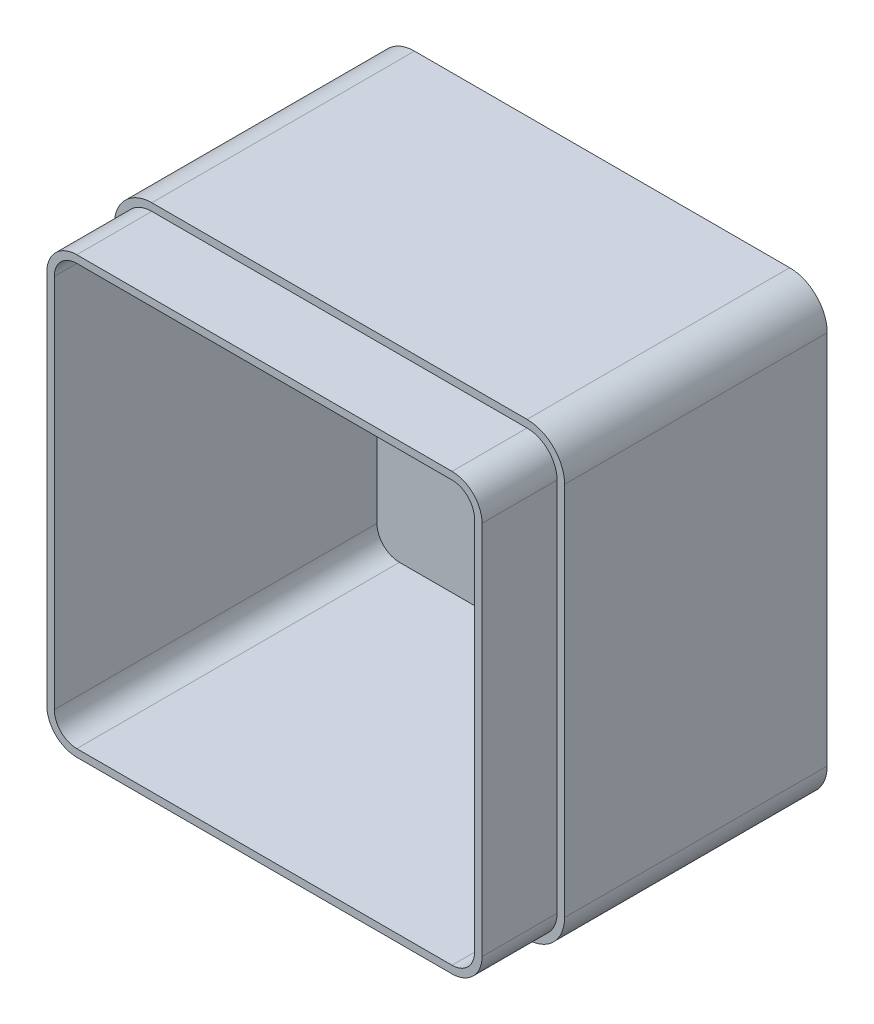
ISO-10303-21;
HEADER;
FILE_DESCRIPTION(('STEP AP214'),'2;1');
FILE_NAME('part.step','',(''),(''),'','','');
FILE_SCHEMA(('AUTOMOTIVE_DESIGN { 1 0 10303 214 1 1 1 1 }'));
ENDSEC;
DATA;
#1=APPLICATION_CONTEXT('core data for automotive mechanical design processes');
#2=APPLICATION_PROTOCOL_DEFINITION('international standard','automotive_design',2000,#1);
#3=PRODUCT_CONTEXT('',#1,'mechanical');
#4=PRODUCT('Part','Part','',(#3));
#5=PRODUCT_RELATED_PRODUCT_CATEGORY('part','',(#4));
#6=PRODUCT_DEFINITION_FORMATION('','',#4);
#7=PRODUCT_DEFINITION_CONTEXT('part definition',#1,'design');
#8=PRODUCT_DEFINITION('design','',#6,#7);
#9=PRODUCT_DEFINITION_SHAPE('','',#8);
#10=(LENGTH_UNIT() NAMED_UNIT(*) SI_UNIT(.MILLI.,.METRE.));
#11=(NAMED_UNIT(*) PLANE_ANGLE_UNIT() SI_UNIT($,.RADIAN.));
#12=(NAMED_UNIT(*) SI_UNIT($,.STERADIAN.) SOLID_ANGLE_UNIT());
#13=UNCERTAINTY_MEASURE_WITH_UNIT(LENGTH_MEASURE(1.E-05),#10,'distance_accuracy_value','');
#14=(GEOMETRIC_REPRESENTATION_CONTEXT(3) GLOBAL_UNCERTAINTY_ASSIGNED_CONTEXT((#13)) GLOBAL_UNIT_ASSIGNED_CONTEXT((#10,
#11,#12)) REPRESENTATION_CONTEXT('',''));
#15=CARTESIAN_POINT('',(0.,0.,0.));
#16=DIRECTION('',(0.,0.,1.));
#17=DIRECTION('',(1.,0.,0.));
#18=AXIS2_PLACEMENT_3D('',#15,#16,#17);
#19=CARTESIAN_POINT('',(0.,0.,90.));
#20=DIRECTION('',(0.,0.,-1.));
#21=DIRECTION('',(-1.,0.,0.));
#22=AXIS2_PLACEMENT_3D('',#19,#20,#21);
#23=PLANE('',#22);
#24=DIRECTION('',(0.,-1.,0.));
#25=VECTOR('',#24,1.);
#26=CARTESIAN_POINT('',(4.,0.,90.));
#27=LINE('',#26,#25);
#28=CARTESIAN_POINT('',(3.99999999999996,110.,90.));
#29=VERTEX_POINT('',#28);
#30=CARTESIAN_POINT('',(4.,10.,90.));
#31=VERTEX_POINT('',#30);
#32=EDGE_CURVE('E350',#29,#31,#27,.T.);
#33=ORIENTED_EDGE('',*,*,#32,.F.);
#34=CARTESIAN_POINT('',(9.99999999999996,110.,90.));
#35=DIRECTION('',(0.,0.,-1.));
#36=DIRECTION('',(-1.,0.,0.));
#37=AXIS2_PLACEMENT_3D('',#34,#35,#36);
#38=CIRCLE('',#37,6.);
#39=CARTESIAN_POINT('',(9.99999999999996,116.,90.));
#40=VERTEX_POINT('',#39);
#41=EDGE_CURVE('E396',#40,#29,#38,.F.);
#42=ORIENTED_EDGE('',*,*,#41,.F.);
#43=DIRECTION('',(-1.,0.,0.));
#44=VECTOR('',#43,1.);
#45=CARTESIAN_POINT('',(0.,116.,90.));
#46=LINE('',#45,#44);
#47=CARTESIAN_POINT('',(110.,116.,90.));
#48=VERTEX_POINT('',#47);
#49=EDGE_CURVE('E365',#48,#40,#46,.T.);
#50=ORIENTED_EDGE('',*,*,#49,.F.);
#51=CARTESIAN_POINT('',(110.,110.,90.));
#52=DIRECTION('',(0.,0.,-1.));
#53=DIRECTION('',(-1.,0.,0.));
#54=AXIS2_PLACEMENT_3D('',#51,#52,#53);
#55=CIRCLE('',#54,6.);
#56=CARTESIAN_POINT('',(116.,110.,90.));
#57=VERTEX_POINT('',#56);
#58=EDGE_CURVE('E329',#57,#48,#55,.F.);
#59=ORIENTED_EDGE('',*,*,#58,.F.);
#60=DIRECTION('',(0.,1.,0.));
#61=VECTOR('',#60,1.);
#62=CARTESIAN_POINT('',(116.,0.,90.));
#63=LINE('',#62,#61);
#64=CARTESIAN_POINT('',(116.,10.,90.));
#65=VERTEX_POINT('',#64);
#66=EDGE_CURVE('E393',#65,#57,#63,.T.);
#67=ORIENTED_EDGE('',*,*,#66,.F.);
#68=CARTESIAN_POINT('',(110.,10.,90.));
#69=DIRECTION('',(0.,0.,-1.));
#70=DIRECTION('',(-1.,0.,0.));
#71=AXIS2_PLACEMENT_3D('',#68,#69,#70);
#72=CIRCLE('',#71,6.);
#73=CARTESIAN_POINT('',(110.,4.,90.));
#74=VERTEX_POINT('',#73);
#75=EDGE_CURVE('E389',#74,#65,#72,.F.);
#76=ORIENTED_EDGE('',*,*,#75,.F.);
#77=DIRECTION('',(1.,0.,0.));
#78=VECTOR('',#77,1.);
#79=CARTESIAN_POINT('',(0.,4.,90.));
#80=LINE('',#79,#78);
#81=CARTESIAN_POINT('',(9.99999999999999,4.,90.));
#82=VERTEX_POINT('',#81);
#83=EDGE_CURVE('E386',#82,#74,#80,.T.);
#84=ORIENTED_EDGE('',*,*,#83,.F.);
#85=CARTESIAN_POINT('',(9.99999999999999,10.,90.));
#86=DIRECTION('',(0.,0.,-1.));
#87=DIRECTION('',(-1.,0.,0.));
#88=AXIS2_PLACEMENT_3D('',#85,#86,#87);
#89=CIRCLE('',#88,6.);
#90=EDGE_CURVE('E374',#31,#82,#89,.F.);
#91=ORIENTED_EDGE('',*,*,#90,.F.);
#92=EDGE_LOOP('',(#33,#42,#50,#59,#67,#76,#84,#91));
#93=FACE_BOUND('',#92,.T.);
#94=CARTESIAN_POINT('',(9.99999999999996,110.,90.));
#95=DIRECTION('',(0.,0.,1.));
#96=DIRECTION('',(1.,0.,0.));
#97=AXIS2_PLACEMENT_3D('',#94,#95,#96);
#98=CIRCLE('',#97,8.);
#99=CARTESIAN_POINT('',(9.99999999999995,118.,90.));
#100=VERTEX_POINT('',#99);
#101=CARTESIAN_POINT('',(1.99999999999996,110.,90.));
#102=VERTEX_POINT('',#101);
#103=EDGE_CURVE('E257',#100,#102,#98,.T.);
#104=ORIENTED_EDGE('',*,*,#103,.T.);
#105=DIRECTION('',(0.,-1.,0.));
#106=VECTOR('',#105,1.);
#107=CARTESIAN_POINT('',(1.99999999999996,110.,90.));
#108=LINE('',#107,#106);
#109=CARTESIAN_POINT('',(1.99999999999996,9.99999999999999,90.));
#110=VERTEX_POINT('',#109);
#111=EDGE_CURVE('E207',#102,#110,#108,.T.);
#112=ORIENTED_EDGE('',*,*,#111,.T.);
#113=CARTESIAN_POINT('',(9.99999999999999,10.,90.));
#114=DIRECTION('',(0.,0.,1.));
#115=DIRECTION('',(1.,0.,0.));
#116=AXIS2_PLACEMENT_3D('',#113,#114,#115);
#117=CIRCLE('',#116,8.00000000000001);
#118=CARTESIAN_POINT('',(9.99999999999999,1.99999999999998,90.));
#119=VERTEX_POINT('',#118);
#120=EDGE_CURVE('E55',#110,#119,#117,.T.);
#121=ORIENTED_EDGE('',*,*,#120,.T.);
#122=DIRECTION('',(1.,0.,0.));
#123=VECTOR('',#122,1.);
#124=CARTESIAN_POINT('',(9.99999999999999,2.,90.));
#125=LINE('',#124,#123);
#126=CARTESIAN_POINT('',(110.,2.,90.));
#127=VERTEX_POINT('',#126);
#128=EDGE_CURVE('E264',#119,#127,#125,.T.);
#129=ORIENTED_EDGE('',*,*,#128,.T.);
#130=CARTESIAN_POINT('',(110.,10.,90.));
#131=DIRECTION('',(0.,0.,1.));
#132=DIRECTION('',(1.,0.,0.));
#133=AXIS2_PLACEMENT_3D('',#130,#131,#132);
#134=CIRCLE('',#133,7.99999999999999);
#135=CARTESIAN_POINT('',(118.,10.,90.));
#136=VERTEX_POINT('',#135);
#137=EDGE_CURVE('E268',#127,#136,#134,.T.);
#138=ORIENTED_EDGE('',*,*,#137,.T.);
#139=DIRECTION('',(0.,1.,0.));
#140=VECTOR('',#139,1.);
#141=CARTESIAN_POINT('',(118.,9.99999999999999,90.));
#142=LINE('',#141,#140);
#143=CARTESIAN_POINT('',(118.,110.,90.));
#144=VERTEX_POINT('',#143);
#145=EDGE_CURVE('E272',#136,#144,#142,.T.);
#146=ORIENTED_EDGE('',*,*,#145,.T.);
#147=CARTESIAN_POINT('',(110.,110.,90.));
#148=DIRECTION('',(0.,0.,1.));
#149=DIRECTION('',(1.,0.,0.));
#150=AXIS2_PLACEMENT_3D('',#147,#148,#149);
#151=CIRCLE('',#150,8.00000000000001);
#152=CARTESIAN_POINT('',(110.,118.,90.));
#153=VERTEX_POINT('',#152);
#154=EDGE_CURVE('E234',#144,#153,#151,.T.);
#155=ORIENTED_EDGE('',*,*,#154,.T.);
#156=DIRECTION('',(-1.,0.,0.));
#157=VECTOR('',#156,1.);
#158=CARTESIAN_POINT('',(110.,118.,90.));
#159=LINE('',#158,#157);
#160=EDGE_CURVE('E230',#153,#100,#159,.T.);
#161=ORIENTED_EDGE('',*,*,#160,.T.);
#162=EDGE_LOOP('',(#104,#112,#121,#129,#138,#146,#155,#161));
#163=FACE_BOUND('',#162,.T.);
#164=ADVANCED_FACE('F39',(#93,#163),#23,.F.);
#165=CARTESIAN_POINT('',(4.,0.,90.));
#166=DIRECTION('',(1.,0.,0.));
#167=DIRECTION('',(0.,1.,0.));
#168=AXIS2_PLACEMENT_3D('',#165,#166,#167);
#169=PLANE('',#168);
#170=DIRECTION('',(0.,-1.,0.));
#171=VECTOR('',#170,1.);
#172=CARTESIAN_POINT('',(4.,0.,4.));
#173=LINE('',#172,#171);
#174=CARTESIAN_POINT('',(3.99999999999996,110.,4.));
#175=VERTEX_POINT('',#174);
#176=CARTESIAN_POINT('',(4.,10.,4.));
#177=VERTEX_POINT('',#176);
#178=EDGE_CURVE('E321',#175,#177,#173,.T.);
#179=ORIENTED_EDGE('',*,*,#178,.F.);
#180=DIRECTION('',(0.,0.,1.));
#181=VECTOR('',#180,1.);
#182=CARTESIAN_POINT('',(3.99999999999996,110.,90.));
#183=LINE('',#182,#181);
#184=EDGE_CURVE('E330',#29,#175,#183,.F.);
#185=ORIENTED_EDGE('',*,*,#184,.F.);
#186=ORIENTED_EDGE('',*,*,#32,.T.);
#187=DIRECTION('',(0.,0.,1.));
#188=VECTOR('',#187,1.);
#189=CARTESIAN_POINT('',(4.,10.,90.));
#190=LINE('',#189,#188);
#191=EDGE_CURVE('E326',#177,#31,#190,.T.);
#192=ORIENTED_EDGE('',*,*,#191,.F.);
#193=EDGE_LOOP('',(#179,#185,#186,#192));
#194=FACE_BOUND('',#193,.T.);
#195=ADVANCED_FACE('F504',(#194),#169,.T.);
#196=CARTESIAN_POINT('',(0.,4.,90.));
#197=DIRECTION('',(0.,1.,0.));
#198=DIRECTION('',(0.,0.,1.));
#199=AXIS2_PLACEMENT_3D('',#196,#197,#198);
#200=PLANE('',#199);
#201=ORIENTED_EDGE('',*,*,#83,.T.);
#202=DIRECTION('',(0.,0.,1.));
#203=VECTOR('',#202,1.);
#204=CARTESIAN_POINT('',(110.,4.,90.));
#205=LINE('',#204,#203);
#206=CARTESIAN_POINT('',(110.,4.,4.));
#207=VERTEX_POINT('',#206);
#208=EDGE_CURVE('E362',#207,#74,#205,.T.);
#209=ORIENTED_EDGE('',*,*,#208,.F.);
#210=DIRECTION('',(1.,0.,0.));
#211=VECTOR('',#210,1.);
#212=CARTESIAN_POINT('',(0.,4.,4.));
#213=LINE('',#212,#211);
#214=CARTESIAN_POINT('',(9.99999999999999,4.,4.));
#215=VERTEX_POINT('',#214);
#216=EDGE_CURVE('E325',#215,#207,#213,.T.);
#217=ORIENTED_EDGE('',*,*,#216,.F.);
#218=DIRECTION('',(0.,0.,1.));
#219=VECTOR('',#218,1.);
#220=CARTESIAN_POINT('',(9.99999999999999,4.,90.));
#221=LINE('',#220,#219);
#222=EDGE_CURVE('E353',#82,#215,#221,.F.);
#223=ORIENTED_EDGE('',*,*,#222,.F.);
#224=EDGE_LOOP('',(#201,#209,#217,#223));
#225=FACE_BOUND('',#224,.T.);
#226=ADVANCED_FACE('F510',(#225),#200,.T.);
#227=CARTESIAN_POINT('',(116.,0.,90.));
#228=DIRECTION('',(-1.,0.,0.));
#229=DIRECTION('',(0.,-1.,0.));
#230=AXIS2_PLACEMENT_3D('',#227,#228,#229);
#231=PLANE('',#230);
#232=ORIENTED_EDGE('',*,*,#66,.T.);
#233=DIRECTION('',(0.,0.,1.));
#234=VECTOR('',#233,1.);
#235=CARTESIAN_POINT('',(116.,110.,90.));
#236=LINE('',#235,#234);
#237=CARTESIAN_POINT('',(116.,110.,4.));
#238=VERTEX_POINT('',#237);
#239=EDGE_CURVE('E371',#238,#57,#236,.T.);
#240=ORIENTED_EDGE('',*,*,#239,.F.);
#241=DIRECTION('',(0.,1.,0.));
#242=VECTOR('',#241,1.);
#243=CARTESIAN_POINT('',(116.,0.,4.));
#244=LINE('',#243,#242);
#245=CARTESIAN_POINT('',(116.,10.,4.));
#246=VERTEX_POINT('',#245);
#247=EDGE_CURVE('E338',#246,#238,#244,.T.);
#248=ORIENTED_EDGE('',*,*,#247,.F.);
#249=DIRECTION('',(0.,0.,1.));
#250=VECTOR('',#249,1.);
#251=CARTESIAN_POINT('',(116.,10.,90.));
#252=LINE('',#251,#250);
#253=EDGE_CURVE('E366',#65,#246,#252,.F.);
#254=ORIENTED_EDGE('',*,*,#253,.F.);
#255=EDGE_LOOP('',(#232,#240,#248,#254));
#256=FACE_BOUND('',#255,.T.);
#257=ADVANCED_FACE('F704',(#256),#231,.T.);
#258=CARTESIAN_POINT('',(0.,116.,90.));
#259=DIRECTION('',(0.,-1.,0.));
#260=DIRECTION('',(0.,0.,-1.));
#261=AXIS2_PLACEMENT_3D('',#258,#259,#260);
#262=PLANE('',#261);
#263=DIRECTION('',(-1.,0.,0.));
#264=VECTOR('',#263,1.);
#265=CARTESIAN_POINT('',(0.,116.,4.));
#266=LINE('',#265,#264);
#267=CARTESIAN_POINT('',(110.,116.,4.));
#268=VERTEX_POINT('',#267);
#269=CARTESIAN_POINT('',(9.99999999999996,116.,4.));
#270=VERTEX_POINT('',#269);
#271=EDGE_CURVE('E346',#268,#270,#266,.T.);
#272=ORIENTED_EDGE('',*,*,#271,.F.);
#273=DIRECTION('',(0.,0.,-1.));
#274=VECTOR('',#273,1.);
#275=CARTESIAN_POINT('',(110.,116.,90.));
#276=LINE('',#275,#274);
#277=EDGE_CURVE('E370',#48,#268,#276,.T.);
#278=ORIENTED_EDGE('',*,*,#277,.F.);
#279=ORIENTED_EDGE('',*,*,#49,.T.);
#280=DIRECTION('',(0.,0.,-1.));
#281=VECTOR('',#280,1.);
#282=CARTESIAN_POINT('',(9.99999999999996,116.,90.));
#283=LINE('',#282,#281);
#284=EDGE_CURVE('E378',#270,#40,#283,.F.);
#285=ORIENTED_EDGE('',*,*,#284,.F.);
#286=EDGE_LOOP('',(#272,#278,#279,#285));
#287=FACE_BOUND('',#286,.T.);
#288=ADVANCED_FACE('F694',(#287),#262,.T.);
#289=CARTESIAN_POINT('',(0.,0.,4.));
#290=DIRECTION('',(0.,0.,-1.));
#291=DIRECTION('',(-1.,0.,0.));
#292=AXIS2_PLACEMENT_3D('',#289,#290,#291);
#293=PLANE('',#292);
#294=ORIENTED_EDGE('',*,*,#216,.T.);
#295=CARTESIAN_POINT('',(110.,10.,4.));
#296=DIRECTION('',(0.,0.,-1.));
#297=DIRECTION('',(-1.,0.,0.));
#298=AXIS2_PLACEMENT_3D('',#295,#296,#297);
#299=CIRCLE('',#298,6.);
#300=EDGE_CURVE('E341',#246,#207,#299,.T.);
#301=ORIENTED_EDGE('',*,*,#300,.F.);
#302=ORIENTED_EDGE('',*,*,#247,.T.);
#303=CARTESIAN_POINT('',(110.,110.,4.));
#304=DIRECTION('',(0.,0.,-1.));
#305=DIRECTION('',(-1.,0.,0.));
#306=AXIS2_PLACEMENT_3D('',#303,#304,#305);
#307=CIRCLE('',#306,6.);
#308=EDGE_CURVE('E345',#268,#238,#307,.T.);
#309=ORIENTED_EDGE('',*,*,#308,.F.);
#310=ORIENTED_EDGE('',*,*,#271,.T.);
#311=CARTESIAN_POINT('',(9.99999999999996,110.,4.));
#312=DIRECTION('',(0.,0.,-1.));
#313=DIRECTION('',(-1.,0.,0.));
#314=AXIS2_PLACEMENT_3D('',#311,#312,#313);
#315=CIRCLE('',#314,6.);
#316=EDGE_CURVE('E342',#175,#270,#315,.T.);
#317=ORIENTED_EDGE('',*,*,#316,.F.);
#318=ORIENTED_EDGE('',*,*,#178,.T.);
#319=CARTESIAN_POINT('',(9.99999999999999,10.,4.));
#320=DIRECTION('',(0.,0.,-1.));
#321=DIRECTION('',(-1.,0.,0.));
#322=AXIS2_PLACEMENT_3D('',#319,#320,#321);
#323=CIRCLE('',#322,6.);
#324=EDGE_CURVE('E334',#215,#177,#323,.T.);
#325=ORIENTED_EDGE('',*,*,#324,.F.);
#326=EDGE_LOOP('',(#294,#301,#302,#309,#310,#317,#318,#325));
#327=FACE_BOUND('',#326,.T.);
#328=ADVANCED_FACE('F684',(#327),#293,.F.);
#329=CARTESIAN_POINT('',(9.99999999999999,10.,90.));
#330=DIRECTION('',(0.,0.,-1.));
#331=DIRECTION('',(-1.,0.,0.));
#332=AXIS2_PLACEMENT_3D('',#329,#330,#331);
#333=CYLINDRICAL_SURFACE('',#332,6.);
#334=ORIENTED_EDGE('',*,*,#90,.T.);
#335=ORIENTED_EDGE('',*,*,#222,.T.);
#336=ORIENTED_EDGE('',*,*,#324,.T.);
#337=ORIENTED_EDGE('',*,*,#191,.T.);
#338=EDGE_LOOP('',(#334,#335,#336,#337));
#339=FACE_BOUND('',#338,.T.);
#340=ADVANCED_FACE('F674',(#339),#333,.F.);
#341=CARTESIAN_POINT('',(110.,10.,90.));
#342=DIRECTION('',(0.,0.,-1.));
#343=DIRECTION('',(-1.,0.,0.));
#344=AXIS2_PLACEMENT_3D('',#341,#342,#343);
#345=CYLINDRICAL_SURFACE('',#344,6.);
#346=ORIENTED_EDGE('',*,*,#75,.T.);
#347=ORIENTED_EDGE('',*,*,#253,.T.);
#348=ORIENTED_EDGE('',*,*,#300,.T.);
#349=ORIENTED_EDGE('',*,*,#208,.T.);
#350=EDGE_LOOP('',(#346,#347,#348,#349));
#351=FACE_BOUND('',#350,.T.);
#352=ADVANCED_FACE('F665',(#351),#345,.F.);
#353=CARTESIAN_POINT('',(9.99999999999996,110.,90.));
#354=DIRECTION('',(0.,0.,-1.));
#355=DIRECTION('',(-1.,0.,0.));
#356=AXIS2_PLACEMENT_3D('',#353,#354,#355);
#357=CYLINDRICAL_SURFACE('',#356,6.);
#358=ORIENTED_EDGE('',*,*,#41,.T.);
#359=ORIENTED_EDGE('',*,*,#184,.T.);
#360=ORIENTED_EDGE('',*,*,#316,.T.);
#361=ORIENTED_EDGE('',*,*,#284,.T.);
#362=EDGE_LOOP('',(#358,#359,#360,#361));
#363=FACE_BOUND('',#362,.T.);
#364=ADVANCED_FACE('F656',(#363),#357,.F.);
#365=CARTESIAN_POINT('',(110.,110.,90.));
#366=DIRECTION('',(0.,0.,-1.));
#367=DIRECTION('',(-1.,0.,0.));
#368=AXIS2_PLACEMENT_3D('',#365,#366,#367);
#369=CYLINDRICAL_SURFACE('',#368,6.);
#370=ORIENTED_EDGE('',*,*,#58,.T.);
#371=ORIENTED_EDGE('',*,*,#277,.T.);
#372=ORIENTED_EDGE('',*,*,#308,.T.);
#373=ORIENTED_EDGE('',*,*,#239,.T.);
#374=EDGE_LOOP('',(#370,#371,#372,#373));
#375=FACE_BOUND('',#374,.T.);
#376=ADVANCED_FACE('F517',(#375),#369,.F.);
#377=CARTESIAN_POINT('',(9.99999999999996,110.,70.));
#378=DIRECTION('',(0.,0.,1.));
#379=DIRECTION('',(1.,0.,0.));
#380=AXIS2_PLACEMENT_3D('',#377,#378,#379);
#381=PLANE('',#380);
#382=DIRECTION('',(-1.,0.,0.));
#383=VECTOR('',#382,1.);
#384=CARTESIAN_POINT('',(110.,118.,70.));
#385=LINE('',#384,#383);
#386=CARTESIAN_POINT('',(110.,118.,70.));
#387=VERTEX_POINT('',#386);
#388=CARTESIAN_POINT('',(9.99999999999995,118.,70.));
#389=VERTEX_POINT('',#388);
#390=EDGE_CURVE('E214',#387,#389,#385,.T.);
#391=ORIENTED_EDGE('',*,*,#390,.F.);
#392=CARTESIAN_POINT('',(110.,110.,70.));
#393=DIRECTION('',(0.,0.,1.));
#394=DIRECTION('',(1.,0.,0.));
#395=AXIS2_PLACEMENT_3D('',#392,#393,#394);
#396=CIRCLE('',#395,8.00000000000001);
#397=CARTESIAN_POINT('',(118.,110.,70.));
#398=VERTEX_POINT('',#397);
#399=EDGE_CURVE('E251',#398,#387,#396,.T.);
#400=ORIENTED_EDGE('',*,*,#399,.F.);
#401=DIRECTION('',(0.,1.,0.));
#402=VECTOR('',#401,1.);
#403=CARTESIAN_POINT('',(118.,9.99999999999999,70.));
#404=LINE('',#403,#402);
#405=CARTESIAN_POINT('',(118.,10.,70.));
#406=VERTEX_POINT('',#405);
#407=EDGE_CURVE('E247',#406,#398,#404,.T.);
#408=ORIENTED_EDGE('',*,*,#407,.F.);
#409=CARTESIAN_POINT('',(110.,10.,70.));
#410=DIRECTION('',(0.,0.,1.));
#411=DIRECTION('',(1.,0.,0.));
#412=AXIS2_PLACEMENT_3D('',#409,#410,#411);
#413=CIRCLE('',#412,7.99999999999999);
#414=CARTESIAN_POINT('',(110.,2.,70.));
#415=VERTEX_POINT('',#414);
#416=EDGE_CURVE('E243',#415,#406,#413,.T.);
#417=ORIENTED_EDGE('',*,*,#416,.F.);
#418=DIRECTION('',(1.,0.,0.));
#419=VECTOR('',#418,1.);
#420=CARTESIAN_POINT('',(9.99999999999999,2.,70.));
#421=LINE('',#420,#419);
#422=CARTESIAN_POINT('',(9.99999999999999,1.99999999999998,70.));
#423=VERTEX_POINT('',#422);
#424=EDGE_CURVE('E239',#423,#415,#421,.T.);
#425=ORIENTED_EDGE('',*,*,#424,.F.);
#426=CARTESIAN_POINT('',(9.99999999999999,10.,70.));
#427=DIRECTION('',(0.,0.,1.));
#428=DIRECTION('',(1.,0.,0.));
#429=AXIS2_PLACEMENT_3D('',#426,#427,#428);
#430=CIRCLE('',#429,8.00000000000001);
#431=CARTESIAN_POINT('',(1.99999999999996,9.99999999999999,70.));
#432=VERTEX_POINT('',#431);
#433=EDGE_CURVE('E224',#432,#423,#430,.T.);
#434=ORIENTED_EDGE('',*,*,#433,.F.);
#435=DIRECTION('',(0.,-1.,0.));
#436=VECTOR('',#435,1.);
#437=CARTESIAN_POINT('',(1.99999999999996,110.,70.));
#438=LINE('',#437,#436);
#439=CARTESIAN_POINT('',(1.99999999999996,110.,70.));
#440=VERTEX_POINT('',#439);
#441=EDGE_CURVE('E205',#440,#432,#438,.T.);
#442=ORIENTED_EDGE('',*,*,#441,.F.);
#443=CARTESIAN_POINT('',(9.99999999999996,110.,70.));
#444=DIRECTION('',(0.,0.,1.));
#445=DIRECTION('',(1.,0.,0.));
#446=AXIS2_PLACEMENT_3D('',#443,#444,#445);
#447=CIRCLE('',#446,8.);
#448=EDGE_CURVE('E220',#389,#440,#447,.T.);
#449=ORIENTED_EDGE('',*,*,#448,.F.);
#450=EDGE_LOOP('',(#391,#400,#408,#417,#425,#434,#442,#449));
#451=FACE_BOUND('',#450,.T.);
#452=CARTESIAN_POINT('',(9.99999999999996,110.,70.));
#453=DIRECTION('',(0.,0.,1.));
#454=DIRECTION('',(1.,0.,0.));
#455=AXIS2_PLACEMENT_3D('',#452,#453,#454);
#456=CIRCLE('',#455,10.);
#457=CARTESIAN_POINT('',(9.99999999999996,120.,70.));
#458=VERTEX_POINT('',#457);
#459=CARTESIAN_POINT('',(0.,110.,70.));
#460=VERTEX_POINT('',#459);
#461=EDGE_CURVE('E281',#458,#460,#456,.T.);
#462=ORIENTED_EDGE('',*,*,#461,.T.);
#463=DIRECTION('',(0.,-1.,0.));
#464=VECTOR('',#463,1.);
#465=CARTESIAN_POINT('',(0.,110.,70.));
#466=LINE('',#465,#464);
#467=CARTESIAN_POINT('',(0.,9.99999999999999,70.));
#468=VERTEX_POINT('',#467);
#469=EDGE_CURVE('E301',#460,#468,#466,.T.);
#470=ORIENTED_EDGE('',*,*,#469,.T.);
#471=CARTESIAN_POINT('',(9.99999999999999,10.,70.));
#472=DIRECTION('',(0.,0.,1.));
#473=DIRECTION('',(1.,0.,0.));
#474=AXIS2_PLACEMENT_3D('',#471,#472,#473);
#475=CIRCLE('',#474,10.);
#476=CARTESIAN_POINT('',(9.99999999999999,0.,70.));
#477=VERTEX_POINT('',#476);
#478=EDGE_CURVE('E304',#468,#477,#475,.T.);
#479=ORIENTED_EDGE('',*,*,#478,.T.);
#480=DIRECTION('',(1.,0.,0.));
#481=VECTOR('',#480,1.);
#482=CARTESIAN_POINT('',(9.99999999999999,0.,70.));
#483=LINE('',#482,#481);
#484=CARTESIAN_POINT('',(110.,0.,70.));
#485=VERTEX_POINT('',#484);
#486=EDGE_CURVE('E307',#477,#485,#483,.T.);
#487=ORIENTED_EDGE('',*,*,#486,.T.);
#488=CARTESIAN_POINT('',(110.,10.,70.));
#489=DIRECTION('',(0.,0.,1.));
#490=DIRECTION('',(1.,0.,0.));
#491=AXIS2_PLACEMENT_3D('',#488,#489,#490);
#492=CIRCLE('',#491,9.99999999999999);
#493=CARTESIAN_POINT('',(120.,10.,70.));
#494=VERTEX_POINT('',#493);
#495=EDGE_CURVE('E310',#485,#494,#492,.T.);
#496=ORIENTED_EDGE('',*,*,#495,.T.);
#497=DIRECTION('',(0.,1.,0.));
#498=VECTOR('',#497,1.);
#499=CARTESIAN_POINT('',(120.,10.,70.));
#500=LINE('',#499,#498);
#501=CARTESIAN_POINT('',(120.,110.,70.));
#502=VERTEX_POINT('',#501);
#503=EDGE_CURVE('E63',#494,#502,#500,.T.);
#504=ORIENTED_EDGE('',*,*,#503,.T.);
#505=CARTESIAN_POINT('',(110.,110.,70.));
#506=DIRECTION('',(0.,0.,1.));
#507=DIRECTION('',(1.,0.,0.));
#508=AXIS2_PLACEMENT_3D('',#505,#506,#507);
#509=CIRCLE('',#508,9.99999999999999);
#510=CARTESIAN_POINT('',(110.,120.,70.));
#511=VERTEX_POINT('',#510);
#512=EDGE_CURVE('E315',#502,#511,#509,.T.);
#513=ORIENTED_EDGE('',*,*,#512,.T.);
#514=DIRECTION('',(-1.,0.,0.));
#515=VECTOR('',#514,1.);
#516=CARTESIAN_POINT('',(110.,120.,70.));
#517=LINE('',#516,#515);
#518=EDGE_CURVE('E318',#511,#458,#517,.T.);
#519=ORIENTED_EDGE('',*,*,#518,.T.);
#520=EDGE_LOOP('',(#462,#470,#479,#487,#496,#504,#513,#519));
#521=FACE_BOUND('',#520,.T.);
#522=ADVANCED_FACE('F219',(#451,#521),#381,.T.);
#523=CARTESIAN_POINT('',(9.99999999999996,110.,70.));
#524=DIRECTION('',(0.,0.,1.));
#525=DIRECTION('',(1.,0.,0.));
#526=AXIS2_PLACEMENT_3D('',#523,#524,#525);
#527=CYLINDRICAL_SURFACE('',#526,8.);
#528=ORIENTED_EDGE('',*,*,#103,.F.);
#529=DIRECTION('',(0.,0.,1.));
#530=VECTOR('',#529,1.);
#531=CARTESIAN_POINT('',(9.99999999999995,118.,70.));
#532=LINE('',#531,#530);
#533=EDGE_CURVE('E228',#389,#100,#532,.T.);
#534=ORIENTED_EDGE('',*,*,#533,.F.);
#535=ORIENTED_EDGE('',*,*,#448,.T.);
#536=DIRECTION('',(0.,0.,1.));
#537=VECTOR('',#536,1.);
#538=CARTESIAN_POINT('',(1.99999999999996,110.,70.));
#539=LINE('',#538,#537);
#540=EDGE_CURVE('E202',#440,#102,#539,.T.);
#541=ORIENTED_EDGE('',*,*,#540,.T.);
#542=EDGE_LOOP('',(#528,#534,#535,#541));
#543=FACE_BOUND('',#542,.T.);
#544=ADVANCED_FACE('F227',(#543),#527,.T.);
#545=CARTESIAN_POINT('',(110.,118.,70.));
#546=DIRECTION('',(0.,1.,0.));
#547=DIRECTION('',(0.,0.,1.));
#548=AXIS2_PLACEMENT_3D('',#545,#546,#547);
#549=PLANE('',#548);
#550=ORIENTED_EDGE('',*,*,#160,.F.);
#551=DIRECTION('',(0.,0.,1.));
#552=VECTOR('',#551,1.);
#553=CARTESIAN_POINT('',(110.,118.,70.));
#554=LINE('',#553,#552);
#555=EDGE_CURVE('E282',#387,#153,#554,.T.);
#556=ORIENTED_EDGE('',*,*,#555,.F.);
#557=ORIENTED_EDGE('',*,*,#390,.T.);
#558=ORIENTED_EDGE('',*,*,#533,.T.);
#559=EDGE_LOOP('',(#550,#556,#557,#558));
#560=FACE_BOUND('',#559,.T.);
#561=ADVANCED_FACE('F560',(#560),#549,.T.);
#562=CARTESIAN_POINT('',(110.,110.,70.));
#563=DIRECTION('',(0.,0.,1.));
#564=DIRECTION('',(1.,0.,0.));
#565=AXIS2_PLACEMENT_3D('',#562,#563,#564);
#566=CYLINDRICAL_SURFACE('',#565,8.00000000000001);
#567=ORIENTED_EDGE('',*,*,#154,.F.);
#568=DIRECTION('',(0.,0.,1.));
#569=VECTOR('',#568,1.);
#570=CARTESIAN_POINT('',(118.,110.,70.));
#571=LINE('',#570,#569);
#572=EDGE_CURVE('E285',#398,#144,#571,.T.);
#573=ORIENTED_EDGE('',*,*,#572,.F.);
#574=ORIENTED_EDGE('',*,*,#399,.T.);
#575=ORIENTED_EDGE('',*,*,#555,.T.);
#576=EDGE_LOOP('',(#567,#573,#574,#575));
#577=FACE_BOUND('',#576,.T.);
#578=ADVANCED_FACE('F568',(#577),#566,.T.);
#579=CARTESIAN_POINT('',(118.,9.99999999999999,70.));
#580=DIRECTION('',(1.,0.,0.));
#581=DIRECTION('',(0.,0.,-1.));
#582=AXIS2_PLACEMENT_3D('',#579,#580,#581);
#583=PLANE('',#582);
#584=ORIENTED_EDGE('',*,*,#145,.F.);
#585=DIRECTION('',(0.,0.,1.));
#586=VECTOR('',#585,1.);
#587=CARTESIAN_POINT('',(118.,10.,70.));
#588=LINE('',#587,#586);
#589=EDGE_CURVE('E288',#406,#136,#588,.T.);
#590=ORIENTED_EDGE('',*,*,#589,.F.);
#591=ORIENTED_EDGE('',*,*,#407,.T.);
#592=ORIENTED_EDGE('',*,*,#572,.T.);
#593=EDGE_LOOP('',(#584,#590,#591,#592));
#594=FACE_BOUND('',#593,.T.);
#595=ADVANCED_FACE('F577',(#594),#583,.T.);
#596=CARTESIAN_POINT('',(110.,10.,70.));
#597=DIRECTION('',(0.,0.,1.));
#598=DIRECTION('',(1.,0.,0.));
#599=AXIS2_PLACEMENT_3D('',#596,#597,#598);
#600=CYLINDRICAL_SURFACE('',#599,7.99999999999999);
#601=ORIENTED_EDGE('',*,*,#137,.F.);
#602=DIRECTION('',(0.,0.,1.));
#603=VECTOR('',#602,1.);
#604=CARTESIAN_POINT('',(110.,2.,70.));
#605=LINE('',#604,#603);
#606=EDGE_CURVE('E291',#415,#127,#605,.T.);
#607=ORIENTED_EDGE('',*,*,#606,.F.);
#608=ORIENTED_EDGE('',*,*,#416,.T.);
#609=ORIENTED_EDGE('',*,*,#589,.T.);
#610=EDGE_LOOP('',(#601,#607,#608,#609));
#611=FACE_BOUND('',#610,.T.);
#612=ADVANCED_FACE('F586',(#611),#600,.T.);
#613=CARTESIAN_POINT('',(9.99999999999999,2.,70.));
#614=DIRECTION('',(0.,-1.,0.));
#615=DIRECTION('',(0.,0.,-1.));
#616=AXIS2_PLACEMENT_3D('',#613,#614,#615);
#617=PLANE('',#616);
#618=ORIENTED_EDGE('',*,*,#128,.F.);
#619=DIRECTION('',(0.,0.,1.));
#620=VECTOR('',#619,1.);
#621=CARTESIAN_POINT('',(9.99999999999999,1.99999999999998,70.));
#622=LINE('',#621,#620);
#623=EDGE_CURVE('E294',#423,#119,#622,.T.);
#624=ORIENTED_EDGE('',*,*,#623,.F.);
#625=ORIENTED_EDGE('',*,*,#424,.T.);
#626=ORIENTED_EDGE('',*,*,#606,.T.);
#627=EDGE_LOOP('',(#618,#624,#625,#626));
#628=FACE_BOUND('',#627,.T.);
#629=ADVANCED_FACE('F595',(#628),#617,.T.);
#630=CARTESIAN_POINT('',(9.99999999999999,10.,70.));
#631=DIRECTION('',(0.,0.,1.));
#632=DIRECTION('',(1.,0.,0.));
#633=AXIS2_PLACEMENT_3D('',#630,#631,#632);
#634=CYLINDRICAL_SURFACE('',#633,8.00000000000001);
#635=ORIENTED_EDGE('',*,*,#120,.F.);
#636=DIRECTION('',(0.,0.,1.));
#637=VECTOR('',#636,1.);
#638=CARTESIAN_POINT('',(1.99999999999996,9.99999999999999,70.));
#639=LINE('',#638,#637);
#640=EDGE_CURVE('E213',#432,#110,#639,.T.);
#641=ORIENTED_EDGE('',*,*,#640,.F.);
#642=ORIENTED_EDGE('',*,*,#433,.T.);
#643=ORIENTED_EDGE('',*,*,#623,.T.);
#644=EDGE_LOOP('',(#635,#641,#642,#643));
#645=FACE_BOUND('',#644,.T.);
#646=ADVANCED_FACE('F604',(#645),#634,.T.);
#647=CARTESIAN_POINT('',(1.99999999999996,110.,70.));
#648=DIRECTION('',(-1.,0.,0.));
#649=DIRECTION('',(0.,0.,1.));
#650=AXIS2_PLACEMENT_3D('',#647,#648,#649);
#651=PLANE('',#650);
#652=ORIENTED_EDGE('',*,*,#111,.F.);
#653=ORIENTED_EDGE('',*,*,#540,.F.);
#654=ORIENTED_EDGE('',*,*,#441,.T.);
#655=ORIENTED_EDGE('',*,*,#640,.T.);
#656=EDGE_LOOP('',(#652,#653,#654,#655));
#657=FACE_BOUND('',#656,.T.);
#658=ADVANCED_FACE('F204',(#657),#651,.T.);
#659=CARTESIAN_POINT('',(0.,0.,0.));
#660=DIRECTION('',(0.,0.,-1.));
#661=DIRECTION('',(-1.,0.,0.));
#662=AXIS2_PLACEMENT_3D('',#659,#660,#661);
#663=PLANE('',#662);
#664=DIRECTION('',(1.,0.,0.));
#665=VECTOR('',#664,1.);
#666=CARTESIAN_POINT('',(0.,0.,0.));
#667=LINE('',#666,#665);
#668=CARTESIAN_POINT('',(9.99999999999999,0.,0.));
#669=VERTEX_POINT('',#668);
#670=CARTESIAN_POINT('',(110.,0.,0.));
#671=VERTEX_POINT('',#670);
#672=EDGE_CURVE('E409',#669,#671,#667,.T.);
#673=ORIENTED_EDGE('',*,*,#672,.F.);
#674=CARTESIAN_POINT('',(9.99999999999999,10.,0.));
#675=DIRECTION('',(0.,0.,-1.));
#676=DIRECTION('',(-1.,0.,0.));
#677=AXIS2_PLACEMENT_3D('',#674,#675,#676);
#678=CIRCLE('',#677,10.);
#679=CARTESIAN_POINT('',(0.,9.99999999999999,0.));
#680=VERTEX_POINT('',#679);
#681=EDGE_CURVE('E437',#669,#680,#678,.T.);
#682=ORIENTED_EDGE('',*,*,#681,.T.);
#683=DIRECTION('',(0.,-1.,0.));
#684=VECTOR('',#683,1.);
#685=CARTESIAN_POINT('',(0.,0.,0.));
#686=LINE('',#685,#684);
#687=CARTESIAN_POINT('',(0.,110.,0.));
#688=VERTEX_POINT('',#687);
#689=EDGE_CURVE('E382',#688,#680,#686,.T.);
#690=ORIENTED_EDGE('',*,*,#689,.F.);
#691=CARTESIAN_POINT('',(9.99999999999996,110.,0.));
#692=DIRECTION('',(0.,0.,-1.));
#693=DIRECTION('',(-1.,0.,0.));
#694=AXIS2_PLACEMENT_3D('',#691,#692,#693);
#695=CIRCLE('',#694,10.);
#696=CARTESIAN_POINT('',(9.99999999999996,120.,0.));
#697=VERTEX_POINT('',#696);
#698=EDGE_CURVE('E431',#688,#697,#695,.T.);
#699=ORIENTED_EDGE('',*,*,#698,.T.);
#700=DIRECTION('',(-1.,0.,0.));
#701=VECTOR('',#700,1.);
#702=CARTESIAN_POINT('',(0.,120.,0.));
#703=LINE('',#702,#701);
#704=CARTESIAN_POINT('',(110.,120.,0.));
#705=VERTEX_POINT('',#704);
#706=EDGE_CURVE('E417',#705,#697,#703,.T.);
#707=ORIENTED_EDGE('',*,*,#706,.F.);
#708=CARTESIAN_POINT('',(110.,110.,0.));
#709=DIRECTION('',(0.,0.,-1.));
#710=DIRECTION('',(-1.,0.,0.));
#711=AXIS2_PLACEMENT_3D('',#708,#709,#710);
#712=CIRCLE('',#711,10.);
#713=CARTESIAN_POINT('',(120.,110.,0.));
#714=VERTEX_POINT('',#713);
#715=EDGE_CURVE('E428',#705,#714,#712,.T.);
#716=ORIENTED_EDGE('',*,*,#715,.T.);
#717=DIRECTION('',(0.,1.,0.));
#718=VECTOR('',#717,1.);
#719=CARTESIAN_POINT('',(120.,0.,0.));
#720=LINE('',#719,#718);
#721=CARTESIAN_POINT('',(120.,10.,0.));
#722=VERTEX_POINT('',#721);
#723=EDGE_CURVE('E413',#722,#714,#720,.T.);
#724=ORIENTED_EDGE('',*,*,#723,.F.);
#725=CARTESIAN_POINT('',(110.,10.,0.));
#726=DIRECTION('',(0.,0.,-1.));
#727=DIRECTION('',(-1.,0.,0.));
#728=AXIS2_PLACEMENT_3D('',#725,#726,#727);
#729=CIRCLE('',#728,10.);
#730=EDGE_CURVE('E434',#722,#671,#729,.T.);
#731=ORIENTED_EDGE('',*,*,#730,.T.);
#732=EDGE_LOOP('',(#673,#682,#690,#699,#707,#716,#724,#731));
#733=FACE_BOUND('',#732,.T.);
#734=ADVANCED_FACE('F466',(#733),#663,.T.);
#735=CARTESIAN_POINT('',(9.99999999999996,110.,90.));
#736=DIRECTION('',(0.,0.,-1.));
#737=DIRECTION('',(-1.,0.,0.));
#738=AXIS2_PLACEMENT_3D('',#735,#736,#737);
#739=CYLINDRICAL_SURFACE('',#738,10.);
#740=DIRECTION('',(0.,0.,-1.));
#741=VECTOR('',#740,1.);
#742=CARTESIAN_POINT('',(0.,110.,90.));
#743=LINE('',#742,#741);
#744=EDGE_CURVE('E440',#460,#688,#743,.T.);
#745=ORIENTED_EDGE('',*,*,#744,.F.);
#746=ORIENTED_EDGE('',*,*,#461,.F.);
#747=DIRECTION('',(0.,0.,-1.));
#748=VECTOR('',#747,1.);
#749=CARTESIAN_POINT('',(9.99999999999996,120.,90.));
#750=LINE('',#749,#748);
#751=EDGE_CURVE('E11',#697,#458,#750,.F.);
#752=ORIENTED_EDGE('',*,*,#751,.F.);
#753=ORIENTED_EDGE('',*,*,#698,.F.);
#754=EDGE_LOOP('',(#745,#746,#752,#753));
#755=FACE_BOUND('',#754,.T.);
#756=ADVANCED_FACE('F471',(#755),#739,.T.);
#757=CARTESIAN_POINT('',(110.,110.,90.));
#758=DIRECTION('',(0.,0.,-1.));
#759=DIRECTION('',(-1.,0.,0.));
#760=AXIS2_PLACEMENT_3D('',#757,#758,#759);
#761=CYLINDRICAL_SURFACE('',#760,10.);
#762=DIRECTION('',(0.,0.,-1.));
#763=VECTOR('',#762,1.);
#764=CARTESIAN_POINT('',(110.,120.,90.));
#765=LINE('',#764,#763);
#766=EDGE_CURVE('E48',#511,#705,#765,.T.);
#767=ORIENTED_EDGE('',*,*,#766,.F.);
#768=ORIENTED_EDGE('',*,*,#512,.F.);
#769=DIRECTION('',(0.,0.,-1.));
#770=VECTOR('',#769,1.);
#771=CARTESIAN_POINT('',(120.,110.,90.));
#772=LINE('',#771,#770);
#773=EDGE_CURVE('E447',#714,#502,#772,.F.);
#774=ORIENTED_EDGE('',*,*,#773,.F.);
#775=ORIENTED_EDGE('',*,*,#715,.F.);
#776=EDGE_LOOP('',(#767,#768,#774,#775));
#777=FACE_BOUND('',#776,.T.);
#778=ADVANCED_FACE('F41',(#777),#761,.T.);
#779=CARTESIAN_POINT('',(0.,120.,90.));
#780=DIRECTION('',(0.,-1.,0.));
#781=DIRECTION('',(0.,0.,-1.));
#782=AXIS2_PLACEMENT_3D('',#779,#780,#781);
#783=PLANE('',#782);
#784=ORIENTED_EDGE('',*,*,#518,.F.);
#785=ORIENTED_EDGE('',*,*,#766,.T.);
#786=ORIENTED_EDGE('',*,*,#706,.T.);
#787=ORIENTED_EDGE('',*,*,#751,.T.);
#788=EDGE_LOOP('',(#784,#785,#786,#787));
#789=FACE_BOUND('',#788,.T.);
#790=ADVANCED_FACE('F458',(#789),#783,.F.);
#791=CARTESIAN_POINT('',(110.,10.,90.));
#792=DIRECTION('',(0.,0.,-1.));
#793=DIRECTION('',(-1.,0.,0.));
#794=AXIS2_PLACEMENT_3D('',#791,#792,#793);
#795=CYLINDRICAL_SURFACE('',#794,10.);
#796=DIRECTION('',(0.,0.,-1.));
#797=VECTOR('',#796,1.);
#798=CARTESIAN_POINT('',(120.,10.,90.));
#799=LINE('',#798,#797);
#800=EDGE_CURVE('E451',#494,#722,#799,.T.);
#801=ORIENTED_EDGE('',*,*,#800,.F.);
#802=ORIENTED_EDGE('',*,*,#495,.F.);
#803=DIRECTION('',(0.,0.,-1.));
#804=VECTOR('',#803,1.);
#805=CARTESIAN_POINT('',(110.,0.,90.));
#806=LINE('',#805,#804);
#807=EDGE_CURVE('E421',#671,#485,#806,.F.);
#808=ORIENTED_EDGE('',*,*,#807,.F.);
#809=ORIENTED_EDGE('',*,*,#730,.F.);
#810=EDGE_LOOP('',(#801,#802,#808,#809));
#811=FACE_BOUND('',#810,.T.);
#812=ADVANCED_FACE('F490',(#811),#795,.T.);
#813=CARTESIAN_POINT('',(120.,0.,90.));
#814=DIRECTION('',(-1.,0.,0.));
#815=DIRECTION('',(0.,-1.,0.));
#816=AXIS2_PLACEMENT_3D('',#813,#814,#815);
#817=PLANE('',#816);
#818=ORIENTED_EDGE('',*,*,#503,.F.);
#819=ORIENTED_EDGE('',*,*,#800,.T.);
#820=ORIENTED_EDGE('',*,*,#723,.T.);
#821=ORIENTED_EDGE('',*,*,#773,.T.);
#822=EDGE_LOOP('',(#818,#819,#820,#821));
#823=FACE_BOUND('',#822,.T.);
#824=ADVANCED_FACE('F492',(#823),#817,.F.);
#825=CARTESIAN_POINT('',(9.99999999999999,10.,90.));
#826=DIRECTION('',(0.,0.,-1.));
#827=DIRECTION('',(-1.,0.,0.));
#828=AXIS2_PLACEMENT_3D('',#825,#826,#827);
#829=CYLINDRICAL_SURFACE('',#828,10.);
#830=DIRECTION('',(0.,0.,-1.));
#831=VECTOR('',#830,1.);
#832=CARTESIAN_POINT('',(9.99999999999999,0.,90.));
#833=LINE('',#832,#831);
#834=EDGE_CURVE('E425',#477,#669,#833,.T.);
#835=ORIENTED_EDGE('',*,*,#834,.F.);
#836=ORIENTED_EDGE('',*,*,#478,.F.);
#837=DIRECTION('',(0.,0.,-1.));
#838=VECTOR('',#837,1.);
#839=CARTESIAN_POINT('',(0.,9.99999999999999,90.));
#840=LINE('',#839,#838);
#841=EDGE_CURVE('E443',#680,#468,#840,.F.);
#842=ORIENTED_EDGE('',*,*,#841,.F.);
#843=ORIENTED_EDGE('',*,*,#681,.F.);
#844=EDGE_LOOP('',(#835,#836,#842,#843));
#845=FACE_BOUND('',#844,.T.);
#846=ADVANCED_FACE('F481',(#845),#829,.T.);
#847=CARTESIAN_POINT('',(0.,0.,90.));
#848=DIRECTION('',(0.,1.,0.));
#849=DIRECTION('',(0.,0.,1.));
#850=AXIS2_PLACEMENT_3D('',#847,#848,#849);
#851=PLANE('',#850);
#852=ORIENTED_EDGE('',*,*,#486,.F.);
#853=ORIENTED_EDGE('',*,*,#834,.T.);
#854=ORIENTED_EDGE('',*,*,#672,.T.);
#855=ORIENTED_EDGE('',*,*,#807,.T.);
#856=EDGE_LOOP('',(#852,#853,#854,#855));
#857=FACE_BOUND('',#856,.T.);
#858=ADVANCED_FACE('F485',(#857),#851,.F.);
#859=CARTESIAN_POINT('',(0.,0.,90.));
#860=DIRECTION('',(1.,0.,0.));
#861=DIRECTION('',(0.,1.,0.));
#862=AXIS2_PLACEMENT_3D('',#859,#860,#861);
#863=PLANE('',#862);
#864=ORIENTED_EDGE('',*,*,#469,.F.);
#865=ORIENTED_EDGE('',*,*,#744,.T.);
#866=ORIENTED_EDGE('',*,*,#689,.T.);
#867=ORIENTED_EDGE('',*,*,#841,.T.);
#868=EDGE_LOOP('',(#864,#865,#866,#867));
#869=FACE_BOUND('',#868,.T.);
#870=ADVANCED_FACE('F476',(#869),#863,.F.);
#871=CLOSED_SHELL('',(#164,#195,#226,#257,#288,#328,#340,#352,#364,#376,#522,#544,#561,#578,
#595,#612,#629,#646,#658,#734,#756,#778,#790,#812,#824,#846,#858,#870));
#872=MANIFOLD_SOLID_BREP('B2',#871);
#873=ADVANCED_BREP_SHAPE_REPRESENTATION('',(#18,#872),#14);
#874=SHAPE_DEFINITION_REPRESENTATION(#9,#873);
ENDSEC;
END-ISO-10303-21;
